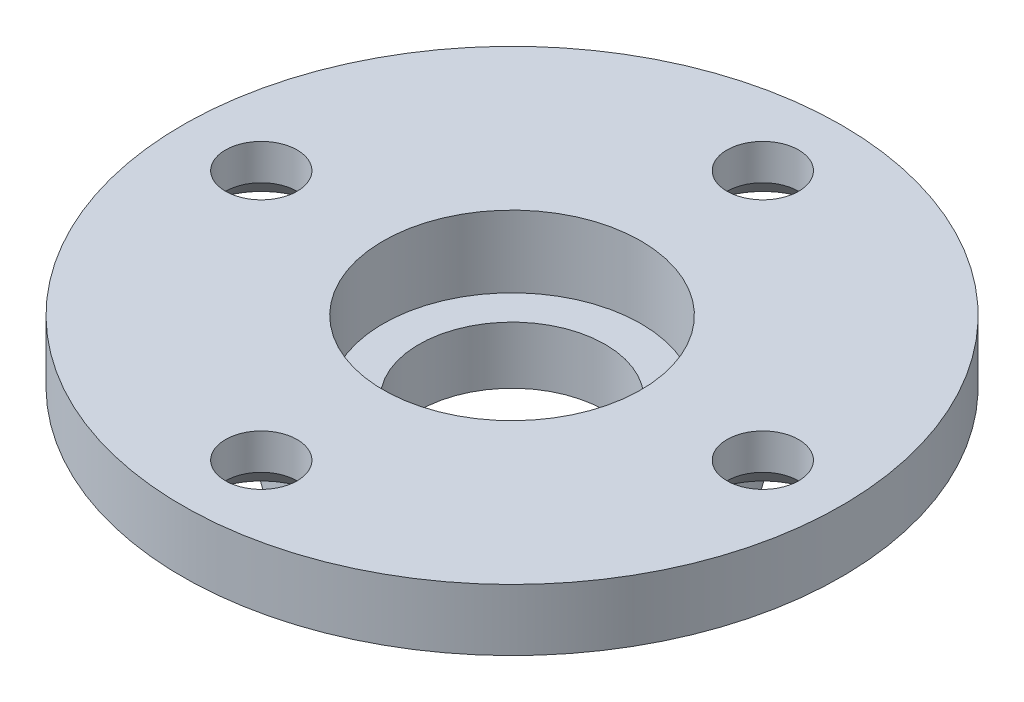
ISO-10303-21;
HEADER;
FILE_DESCRIPTION(('STEP AP214'),'2;1');
FILE_NAME('part.step','',(''),(''),'','','');
FILE_SCHEMA(('AUTOMOTIVE_DESIGN { 1 0 10303 214 1 1 1 1 }'));
ENDSEC;
DATA;
#1=APPLICATION_CONTEXT('core data for automotive mechanical design processes');
#2=APPLICATION_PROTOCOL_DEFINITION('international standard','automotive_design',2000,#1);
#3=PRODUCT_CONTEXT('',#1,'mechanical');
#4=PRODUCT('Part','Part','',(#3));
#5=PRODUCT_RELATED_PRODUCT_CATEGORY('part','',(#4));
#6=PRODUCT_DEFINITION_FORMATION('','',#4);
#7=PRODUCT_DEFINITION_CONTEXT('part definition',#1,'design');
#8=PRODUCT_DEFINITION('design','',#6,#7);
#9=PRODUCT_DEFINITION_SHAPE('','',#8);
#10=(LENGTH_UNIT() NAMED_UNIT(*) SI_UNIT(.MILLI.,.METRE.));
#11=(NAMED_UNIT(*) PLANE_ANGLE_UNIT() SI_UNIT($,.RADIAN.));
#12=(NAMED_UNIT(*) SI_UNIT($,.STERADIAN.) SOLID_ANGLE_UNIT());
#13=UNCERTAINTY_MEASURE_WITH_UNIT(LENGTH_MEASURE(1.E-05),#10,'distance_accuracy_value','');
#14=(GEOMETRIC_REPRESENTATION_CONTEXT(3) GLOBAL_UNCERTAINTY_ASSIGNED_CONTEXT((#13)) GLOBAL_UNIT_ASSIGNED_CONTEXT((#10,
#11,#12)) REPRESENTATION_CONTEXT('',''));
#15=CARTESIAN_POINT('',(0.,0.,0.));
#16=DIRECTION('',(0.,0.,1.));
#17=DIRECTION('',(1.,0.,0.));
#18=AXIS2_PLACEMENT_3D('',#15,#16,#17);
#19=CARTESIAN_POINT('',(6.5,0.,0.));
#20=DIRECTION('',(0.,-1.,0.));
#21=DIRECTION('',(0.,0.,-1.));
#22=AXIS2_PLACEMENT_3D('',#19,#20,#21);
#23=PLANE('',#22);
#24=CARTESIAN_POINT('',(0.,0.,0.));
#25=DIRECTION('',(0.,-1.,0.));
#26=DIRECTION('',(0.,0.,-1.));
#27=AXIS2_PLACEMENT_3D('',#24,#25,#26);
#28=CIRCLE('',#27,12.5);
#29=CARTESIAN_POINT('',(0.,0.,-12.5));
#30=VERTEX_POINT('',#29);
#31=EDGE_CURVE('E76',#30,#30,#28,.T.);
#32=ORIENTED_EDGE('',*,*,#31,.T.);
#33=EDGE_LOOP('',(#32));
#34=FACE_BOUND('',#33,.T.);
#35=CARTESIAN_POINT('',(0.,0.,0.));
#36=DIRECTION('',(0.,-1.,0.));
#37=DIRECTION('',(0.,0.,-1.));
#38=AXIS2_PLACEMENT_3D('',#35,#36,#37);
#39=CIRCLE('',#38,6.5);
#40=CARTESIAN_POINT('',(0.,0.,-6.5));
#41=VERTEX_POINT('',#40);
#42=EDGE_CURVE('E10',#41,#41,#39,.T.);
#43=ORIENTED_EDGE('',*,*,#42,.F.);
#44=EDGE_LOOP('',(#43));
#45=FACE_BOUND('',#44,.T.);
#46=ADVANCED_FACE('F41',(#34,#45),#23,.T.);
#47=CARTESIAN_POINT('',(0.,0.,0.));
#48=DIRECTION('',(0.,-1.,0.));
#49=DIRECTION('',(0.,0.,-1.));
#50=AXIS2_PLACEMENT_3D('',#47,#48,#49);
#51=CYLINDRICAL_SURFACE('',#50,6.5);
#52=ORIENTED_EDGE('',*,*,#42,.T.);
#53=EDGE_LOOP('',(#52));
#54=FACE_BOUND('',#53,.T.);
#55=CARTESIAN_POINT('',(0.,4.,0.));
#56=DIRECTION('',(0.,-1.,0.));
#57=DIRECTION('',(0.,0.,-1.));
#58=AXIS2_PLACEMENT_3D('',#55,#56,#57);
#59=CIRCLE('',#58,6.5);
#60=CARTESIAN_POINT('',(0.,4.,-6.5));
#61=VERTEX_POINT('',#60);
#62=EDGE_CURVE('E48',#61,#61,#59,.T.);
#63=ORIENTED_EDGE('',*,*,#62,.F.);
#64=EDGE_LOOP('',(#63));
#65=FACE_BOUND('',#64,.T.);
#66=ADVANCED_FACE('F155',(#54,#65),#51,.F.);
#67=CARTESIAN_POINT('',(6.5,4.,0.));
#68=DIRECTION('',(0.,1.,0.));
#69=DIRECTION('',(0.,0.,1.));
#70=AXIS2_PLACEMENT_3D('',#67,#68,#69);
#71=PLANE('',#70);
#72=ORIENTED_EDGE('',*,*,#62,.T.);
#73=EDGE_LOOP('',(#72));
#74=FACE_BOUND('',#73,.T.);
#75=CARTESIAN_POINT('',(0.,4.,0.));
#76=DIRECTION('',(0.,-1.,0.));
#77=DIRECTION('',(0.,0.,-1.));
#78=AXIS2_PLACEMENT_3D('',#75,#76,#77);
#79=CIRCLE('',#78,9.);
#80=CARTESIAN_POINT('',(0.,4.,-9.));
#81=VERTEX_POINT('',#80);
#82=EDGE_CURVE('E53',#81,#81,#79,.T.);
#83=ORIENTED_EDGE('',*,*,#82,.F.);
#84=EDGE_LOOP('',(#83));
#85=FACE_BOUND('',#84,.T.);
#86=ADVANCED_FACE('F159',(#74,#85),#71,.T.);
#87=CARTESIAN_POINT('',(0.,0.,0.));
#88=DIRECTION('',(0.,-1.,0.));
#89=DIRECTION('',(0.,0.,-1.));
#90=AXIS2_PLACEMENT_3D('',#87,#88,#89);
#91=CYLINDRICAL_SURFACE('',#90,9.);
#92=ORIENTED_EDGE('',*,*,#82,.T.);
#93=EDGE_LOOP('',(#92));
#94=FACE_BOUND('',#93,.T.);
#95=CARTESIAN_POINT('',(0.,9.,0.));
#96=DIRECTION('',(0.,-1.,0.));
#97=DIRECTION('',(0.,0.,-1.));
#98=AXIS2_PLACEMENT_3D('',#95,#96,#97);
#99=CIRCLE('',#98,9.);
#100=CARTESIAN_POINT('',(0.,9.,-9.));
#101=VERTEX_POINT('',#100);
#102=EDGE_CURVE('E58',#101,#101,#99,.T.);
#103=ORIENTED_EDGE('',*,*,#102,.F.);
#104=EDGE_LOOP('',(#103));
#105=FACE_BOUND('',#104,.T.);
#106=ADVANCED_FACE('F163',(#94,#105),#91,.F.);
#107=CARTESIAN_POINT('',(9.,9.,0.));
#108=DIRECTION('',(0.,1.,0.));
#109=DIRECTION('',(0.,0.,1.));
#110=AXIS2_PLACEMENT_3D('',#107,#108,#109);
#111=PLANE('',#110);
#112=CARTESIAN_POINT('',(1.83302770289265E-13,9.,17.5));
#113=DIRECTION('',(0.,1.,0.));
#114=DIRECTION('',(0.,0.,1.));
#115=AXIS2_PLACEMENT_3D('',#112,#113,#114);
#116=CIRCLE('',#115,2.5);
#117=CARTESIAN_POINT('',(1.83302770289265E-13,9.,20.));
#118=VERTEX_POINT('',#117);
#119=EDGE_CURVE('E116',#118,#118,#116,.T.);
#120=ORIENTED_EDGE('',*,*,#119,.F.);
#121=EDGE_LOOP('',(#120));
#122=FACE_BOUND('',#121,.T.);
#123=CARTESIAN_POINT('',(-17.5,9.,0.));
#124=DIRECTION('',(0.,1.,0.));
#125=DIRECTION('',(0.,0.,1.));
#126=AXIS2_PLACEMENT_3D('',#123,#124,#125);
#127=CIRCLE('',#126,2.5);
#128=CARTESIAN_POINT('',(-17.5,9.,2.5));
#129=VERTEX_POINT('',#128);
#130=EDGE_CURVE('E104',#129,#129,#127,.T.);
#131=ORIENTED_EDGE('',*,*,#130,.F.);
#132=EDGE_LOOP('',(#131));
#133=FACE_BOUND('',#132,.T.);
#134=CARTESIAN_POINT('',(0.,9.,-17.5));
#135=DIRECTION('',(0.,1.,0.));
#136=DIRECTION('',(0.,0.,1.));
#137=AXIS2_PLACEMENT_3D('',#134,#135,#136);
#138=CIRCLE('',#137,2.5);
#139=CARTESIAN_POINT('',(0.,9.,-15.));
#140=VERTEX_POINT('',#139);
#141=EDGE_CURVE('E92',#140,#140,#138,.T.);
#142=ORIENTED_EDGE('',*,*,#141,.F.);
#143=EDGE_LOOP('',(#142));
#144=FACE_BOUND('',#143,.T.);
#145=CARTESIAN_POINT('',(17.5,9.,0.));
#146=DIRECTION('',(0.,1.,0.));
#147=DIRECTION('',(0.,0.,1.));
#148=AXIS2_PLACEMENT_3D('',#145,#146,#147);
#149=CIRCLE('',#148,2.5);
#150=CARTESIAN_POINT('',(17.5,9.,2.5));
#151=VERTEX_POINT('',#150);
#152=EDGE_CURVE('E80',#151,#151,#149,.T.);
#153=ORIENTED_EDGE('',*,*,#152,.F.);
#154=EDGE_LOOP('',(#153));
#155=FACE_BOUND('',#154,.T.);
#156=ORIENTED_EDGE('',*,*,#102,.T.);
#157=EDGE_LOOP('',(#156));
#158=FACE_BOUND('',#157,.T.);
#159=CARTESIAN_POINT('',(0.,9.,0.));
#160=DIRECTION('',(0.,-1.,0.));
#161=DIRECTION('',(0.,0.,-1.));
#162=AXIS2_PLACEMENT_3D('',#159,#160,#161);
#163=CIRCLE('',#162,23.);
#164=CARTESIAN_POINT('',(0.,9.,-23.));
#165=VERTEX_POINT('',#164);
#166=EDGE_CURVE('E64',#165,#165,#163,.T.);
#167=ORIENTED_EDGE('',*,*,#166,.F.);
#168=EDGE_LOOP('',(#167));
#169=FACE_BOUND('',#168,.T.);
#170=ADVANCED_FACE('F169',(#122,#133,#144,#155,#158,#169),#111,.T.);
#171=CARTESIAN_POINT('',(0.,0.,0.));
#172=DIRECTION('',(0.,-1.,0.));
#173=DIRECTION('',(0.,0.,-1.));
#174=AXIS2_PLACEMENT_3D('',#171,#172,#173);
#175=CYLINDRICAL_SURFACE('',#174,23.);
#176=ORIENTED_EDGE('',*,*,#166,.T.);
#177=EDGE_LOOP('',(#176));
#178=FACE_BOUND('',#177,.T.);
#179=CARTESIAN_POINT('',(0.,4.7,0.));
#180=DIRECTION('',(0.,-1.,0.));
#181=DIRECTION('',(0.,0.,-1.));
#182=AXIS2_PLACEMENT_3D('',#179,#180,#181);
#183=CIRCLE('',#182,23.);
#184=CARTESIAN_POINT('',(0.,4.7,-23.));
#185=VERTEX_POINT('',#184);
#186=EDGE_CURVE('E68',#185,#185,#183,.T.);
#187=ORIENTED_EDGE('',*,*,#186,.F.);
#188=EDGE_LOOP('',(#187));
#189=FACE_BOUND('',#188,.T.);
#190=ADVANCED_FACE('F135',(#178,#189),#175,.T.);
#191=CARTESIAN_POINT('',(23.,4.7,0.));
#192=DIRECTION('',(0.,-1.,0.));
#193=DIRECTION('',(0.,0.,-1.));
#194=AXIS2_PLACEMENT_3D('',#191,#192,#193);
#195=PLANE('',#194);
#196=CARTESIAN_POINT('',(1.83302770289265E-13,4.7,17.5));
#197=DIRECTION('',(0.,-1.,0.));
#198=DIRECTION('',(0.,0.,-1.));
#199=AXIS2_PLACEMENT_3D('',#196,#197,#198);
#200=CIRCLE('',#199,4.3);
#201=CARTESIAN_POINT('',(1.83302770289265E-13,4.7,13.2));
#202=VERTEX_POINT('',#201);
#203=EDGE_CURVE('E124',#202,#202,#200,.T.);
#204=ORIENTED_EDGE('',*,*,#203,.F.);
#205=EDGE_LOOP('',(#204));
#206=FACE_BOUND('',#205,.T.);
#207=CARTESIAN_POINT('',(-17.5,4.7,0.));
#208=DIRECTION('',(0.,-1.,0.));
#209=DIRECTION('',(0.,0.,-1.));
#210=AXIS2_PLACEMENT_3D('',#207,#208,#209);
#211=CIRCLE('',#210,4.3);
#212=CARTESIAN_POINT('',(-17.5,4.7,-4.3));
#213=VERTEX_POINT('',#212);
#214=EDGE_CURVE('E112',#213,#213,#211,.T.);
#215=ORIENTED_EDGE('',*,*,#214,.F.);
#216=EDGE_LOOP('',(#215));
#217=FACE_BOUND('',#216,.T.);
#218=CARTESIAN_POINT('',(0.,4.7,-17.5));
#219=DIRECTION('',(0.,-1.,0.));
#220=DIRECTION('',(0.,0.,-1.));
#221=AXIS2_PLACEMENT_3D('',#218,#219,#220);
#222=CIRCLE('',#221,4.3);
#223=CARTESIAN_POINT('',(0.,4.7,-21.8));
#224=VERTEX_POINT('',#223);
#225=EDGE_CURVE('E100',#224,#224,#222,.T.);
#226=ORIENTED_EDGE('',*,*,#225,.F.);
#227=EDGE_LOOP('',(#226));
#228=FACE_BOUND('',#227,.T.);
#229=CARTESIAN_POINT('',(17.5,4.7,0.));
#230=DIRECTION('',(0.,-1.,0.));
#231=DIRECTION('',(0.,0.,-1.));
#232=AXIS2_PLACEMENT_3D('',#229,#230,#231);
#233=CIRCLE('',#232,4.3);
#234=CARTESIAN_POINT('',(17.5,4.7,-4.3));
#235=VERTEX_POINT('',#234);
#236=EDGE_CURVE('E88',#235,#235,#233,.T.);
#237=ORIENTED_EDGE('',*,*,#236,.F.);
#238=EDGE_LOOP('',(#237));
#239=FACE_BOUND('',#238,.T.);
#240=ORIENTED_EDGE('',*,*,#186,.T.);
#241=EDGE_LOOP('',(#240));
#242=FACE_BOUND('',#241,.T.);
#243=CARTESIAN_POINT('',(0.,4.7,0.));
#244=DIRECTION('',(0.,-1.,0.));
#245=DIRECTION('',(0.,0.,-1.));
#246=AXIS2_PLACEMENT_3D('',#243,#244,#245);
#247=CIRCLE('',#246,12.5);
#248=CARTESIAN_POINT('',(0.,4.7,-12.5));
#249=VERTEX_POINT('',#248);
#250=EDGE_CURVE('E72',#249,#249,#247,.T.);
#251=ORIENTED_EDGE('',*,*,#250,.F.);
#252=EDGE_LOOP('',(#251));
#253=FACE_BOUND('',#252,.T.);
#254=ADVANCED_FACE('F131',(#206,#217,#228,#239,#242,#253),#195,.T.);
#255=CARTESIAN_POINT('',(0.,0.,0.));
#256=DIRECTION('',(0.,-1.,0.));
#257=DIRECTION('',(0.,0.,-1.));
#258=AXIS2_PLACEMENT_3D('',#255,#256,#257);
#259=CYLINDRICAL_SURFACE('',#258,12.5);
#260=ORIENTED_EDGE('',*,*,#250,.T.);
#261=EDGE_LOOP('',(#260));
#262=FACE_BOUND('',#261,.T.);
#263=ORIENTED_EDGE('',*,*,#31,.F.);
#264=EDGE_LOOP('',(#263));
#265=FACE_BOUND('',#264,.T.);
#266=ADVANCED_FACE('F134',(#262,#265),#259,.T.);
#267=CARTESIAN_POINT('',(17.5,4.7,0.));
#268=DIRECTION('',(0.,-1.,0.));
#269=DIRECTION('',(0.,0.,-1.));
#270=AXIS2_PLACEMENT_3D('',#267,#268,#269);
#271=CYLINDRICAL_SURFACE('',#270,2.5);
#272=CARTESIAN_POINT('',(17.5,6.5,0.));
#273=DIRECTION('',(0.,-1.,0.));
#274=DIRECTION('',(0.,0.,-1.));
#275=AXIS2_PLACEMENT_3D('',#272,#273,#274);
#276=CIRCLE('',#275,2.5);
#277=CARTESIAN_POINT('',(17.5,6.5,-2.5));
#278=VERTEX_POINT('',#277);
#279=EDGE_CURVE('E84',#278,#278,#276,.T.);
#280=ORIENTED_EDGE('',*,*,#279,.T.);
#281=EDGE_LOOP('',(#280));
#282=FACE_BOUND('',#281,.T.);
#283=ORIENTED_EDGE('',*,*,#152,.T.);
#284=EDGE_LOOP('',(#283));
#285=FACE_BOUND('',#284,.T.);
#286=ADVANCED_FACE('F149',(#282,#285),#271,.F.);
#287=CARTESIAN_POINT('',(17.5,4.7,0.));
#288=DIRECTION('',(0.,-1.,0.));
#289=DIRECTION('',(0.,0.,-1.));
#290=AXIS2_PLACEMENT_3D('',#287,#288,#289);
#291=CONICAL_SURFACE('',#290,4.3,0.785398163397448);
#292=ORIENTED_EDGE('',*,*,#279,.F.);
#293=EDGE_LOOP('',(#292));
#294=FACE_BOUND('',#293,.T.);
#295=ORIENTED_EDGE('',*,*,#236,.T.);
#296=EDGE_LOOP('',(#295));
#297=FACE_BOUND('',#296,.T.);
#298=ADVANCED_FACE('F179',(#294,#297),#291,.F.);
#299=CARTESIAN_POINT('',(0.,4.7,-17.5));
#300=DIRECTION('',(0.,-1.,0.));
#301=DIRECTION('',(0.,0.,-1.));
#302=AXIS2_PLACEMENT_3D('',#299,#300,#301);
#303=CYLINDRICAL_SURFACE('',#302,2.5);
#304=CARTESIAN_POINT('',(0.,6.5,-17.5));
#305=DIRECTION('',(0.,-1.,0.));
#306=DIRECTION('',(0.,0.,-1.));
#307=AXIS2_PLACEMENT_3D('',#304,#305,#306);
#308=CIRCLE('',#307,2.5);
#309=CARTESIAN_POINT('',(0.,6.5,-20.));
#310=VERTEX_POINT('',#309);
#311=EDGE_CURVE('E96',#310,#310,#308,.T.);
#312=ORIENTED_EDGE('',*,*,#311,.T.);
#313=EDGE_LOOP('',(#312));
#314=FACE_BOUND('',#313,.T.);
#315=ORIENTED_EDGE('',*,*,#141,.T.);
#316=EDGE_LOOP('',(#315));
#317=FACE_BOUND('',#316,.T.);
#318=ADVANCED_FACE('F183',(#314,#317),#303,.F.);
#319=CARTESIAN_POINT('',(0.,4.7,-17.5));
#320=DIRECTION('',(0.,-1.,0.));
#321=DIRECTION('',(0.,0.,-1.));
#322=AXIS2_PLACEMENT_3D('',#319,#320,#321);
#323=CONICAL_SURFACE('',#322,4.3,0.785398163397448);
#324=ORIENTED_EDGE('',*,*,#311,.F.);
#325=EDGE_LOOP('',(#324));
#326=FACE_BOUND('',#325,.T.);
#327=ORIENTED_EDGE('',*,*,#225,.T.);
#328=EDGE_LOOP('',(#327));
#329=FACE_BOUND('',#328,.T.);
#330=ADVANCED_FACE('F187',(#326,#329),#323,.F.);
#331=CARTESIAN_POINT('',(-17.5,4.7,0.));
#332=DIRECTION('',(0.,-1.,0.));
#333=DIRECTION('',(0.,0.,-1.));
#334=AXIS2_PLACEMENT_3D('',#331,#332,#333);
#335=CYLINDRICAL_SURFACE('',#334,2.5);
#336=CARTESIAN_POINT('',(-17.5,6.5,0.));
#337=DIRECTION('',(0.,-1.,0.));
#338=DIRECTION('',(0.,0.,-1.));
#339=AXIS2_PLACEMENT_3D('',#336,#337,#338);
#340=CIRCLE('',#339,2.5);
#341=CARTESIAN_POINT('',(-17.5,6.5,-2.5));
#342=VERTEX_POINT('',#341);
#343=EDGE_CURVE('E108',#342,#342,#340,.T.);
#344=ORIENTED_EDGE('',*,*,#343,.T.);
#345=EDGE_LOOP('',(#344));
#346=FACE_BOUND('',#345,.T.);
#347=ORIENTED_EDGE('',*,*,#130,.T.);
#348=EDGE_LOOP('',(#347));
#349=FACE_BOUND('',#348,.T.);
#350=ADVANCED_FACE('F191',(#346,#349),#335,.F.);
#351=CARTESIAN_POINT('',(-17.5,4.7,0.));
#352=DIRECTION('',(0.,-1.,0.));
#353=DIRECTION('',(0.,0.,-1.));
#354=AXIS2_PLACEMENT_3D('',#351,#352,#353);
#355=CONICAL_SURFACE('',#354,4.3,0.785398163397448);
#356=ORIENTED_EDGE('',*,*,#343,.F.);
#357=EDGE_LOOP('',(#356));
#358=FACE_BOUND('',#357,.T.);
#359=ORIENTED_EDGE('',*,*,#214,.T.);
#360=EDGE_LOOP('',(#359));
#361=FACE_BOUND('',#360,.T.);
#362=ADVANCED_FACE('F195',(#358,#361),#355,.F.);
#363=CARTESIAN_POINT('',(1.83302770289265E-13,4.7,17.5));
#364=DIRECTION('',(0.,-1.,0.));
#365=DIRECTION('',(0.,0.,-1.));
#366=AXIS2_PLACEMENT_3D('',#363,#364,#365);
#367=CYLINDRICAL_SURFACE('',#366,2.5);
#368=CARTESIAN_POINT('',(1.83302770289265E-13,6.5,17.5));
#369=DIRECTION('',(0.,-1.,0.));
#370=DIRECTION('',(0.,0.,-1.));
#371=AXIS2_PLACEMENT_3D('',#368,#369,#370);
#372=CIRCLE('',#371,2.5);
#373=CARTESIAN_POINT('',(1.83302770289265E-13,6.5,15.));
#374=VERTEX_POINT('',#373);
#375=EDGE_CURVE('E120',#374,#374,#372,.T.);
#376=ORIENTED_EDGE('',*,*,#375,.T.);
#377=EDGE_LOOP('',(#376));
#378=FACE_BOUND('',#377,.T.);
#379=ORIENTED_EDGE('',*,*,#119,.T.);
#380=EDGE_LOOP('',(#379));
#381=FACE_BOUND('',#380,.T.);
#382=ADVANCED_FACE('F199',(#378,#381),#367,.F.);
#383=CARTESIAN_POINT('',(1.83302770289265E-13,4.7,17.5));
#384=DIRECTION('',(0.,-1.,0.));
#385=DIRECTION('',(0.,0.,-1.));
#386=AXIS2_PLACEMENT_3D('',#383,#384,#385);
#387=CONICAL_SURFACE('',#386,4.3,0.785398163397448);
#388=ORIENTED_EDGE('',*,*,#375,.F.);
#389=EDGE_LOOP('',(#388));
#390=FACE_BOUND('',#389,.T.);
#391=ORIENTED_EDGE('',*,*,#203,.T.);
#392=EDGE_LOOP('',(#391));
#393=FACE_BOUND('',#392,.T.);
#394=ADVANCED_FACE('F129',(#390,#393),#387,.F.);
#395=CLOSED_SHELL('',(#46,#66,#86,#106,#170,#190,#254,#266,#286,#298,#318,#330,#350,#362,#382,#394));
#396=MANIFOLD_SOLID_BREP('B2',#395);
#397=ADVANCED_BREP_SHAPE_REPRESENTATION('',(#18,#396),#14);
#398=SHAPE_DEFINITION_REPRESENTATION(#9,#397);
ENDSEC;
END-ISO-10303-21;
